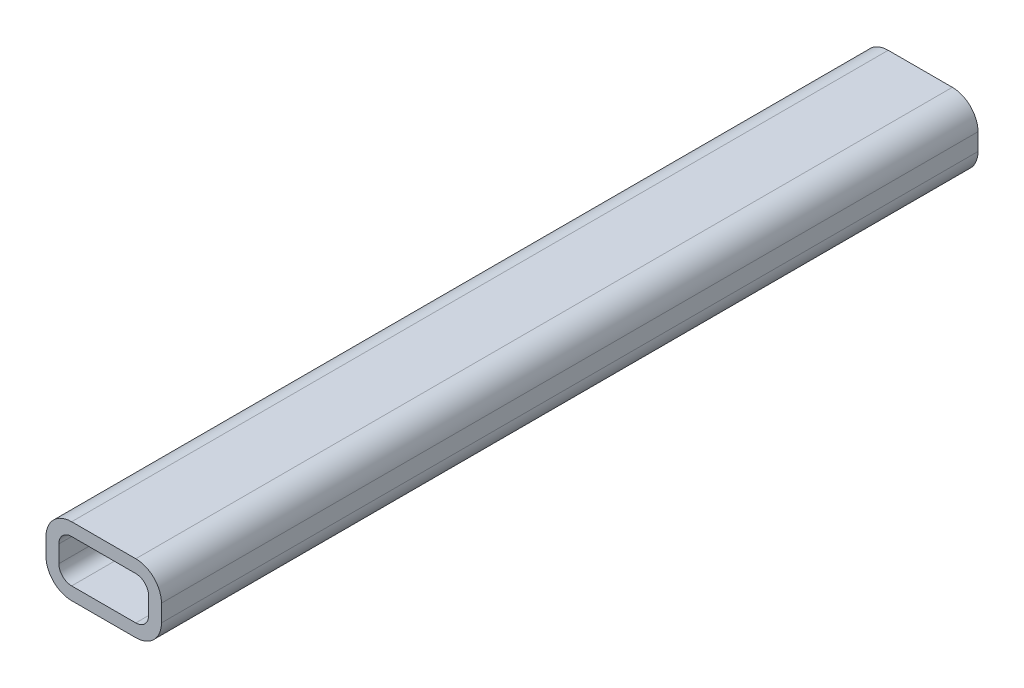
ISO-10303-21;
HEADER;
FILE_DESCRIPTION(('STEP AP214'),'2;1');
FILE_NAME('part.step','',(''),(''),'','','');
FILE_SCHEMA(('AUTOMOTIVE_DESIGN { 1 0 10303 214 1 1 1 1 }'));
ENDSEC;
DATA;
#1=APPLICATION_CONTEXT('core data for automotive mechanical design processes');
#2=APPLICATION_PROTOCOL_DEFINITION('international standard','automotive_design',2000,#1);
#3=PRODUCT_CONTEXT('',#1,'mechanical');
#4=PRODUCT('Part','Part','',(#3));
#5=PRODUCT_RELATED_PRODUCT_CATEGORY('part','',(#4));
#6=PRODUCT_DEFINITION_FORMATION('','',#4);
#7=PRODUCT_DEFINITION_CONTEXT('part definition',#1,'design');
#8=PRODUCT_DEFINITION('design','',#6,#7);
#9=PRODUCT_DEFINITION_SHAPE('','',#8);
#10=(LENGTH_UNIT() NAMED_UNIT(*) SI_UNIT(.MILLI.,.METRE.));
#11=(NAMED_UNIT(*) PLANE_ANGLE_UNIT() SI_UNIT($,.RADIAN.));
#12=(NAMED_UNIT(*) SI_UNIT($,.STERADIAN.) SOLID_ANGLE_UNIT());
#13=UNCERTAINTY_MEASURE_WITH_UNIT(LENGTH_MEASURE(1.E-05),#10,'distance_accuracy_value','');
#14=(GEOMETRIC_REPRESENTATION_CONTEXT(3) GLOBAL_UNCERTAINTY_ASSIGNED_CONTEXT((#13)) GLOBAL_UNIT_ASSIGNED_CONTEXT((#10,
#11,#12)) REPRESENTATION_CONTEXT('',''));
#15=CARTESIAN_POINT('',(0.,0.,0.));
#16=DIRECTION('',(0.,0.,1.));
#17=DIRECTION('',(1.,0.,0.));
#18=AXIS2_PLACEMENT_3D('',#15,#16,#17);
#19=CARTESIAN_POINT('',(0.,-3.,191.));
#20=DIRECTION('',(0.,0.,-1.));
#21=DIRECTION('',(-1.,0.,0.));
#22=AXIS2_PLACEMENT_3D('',#19,#20,#21);
#23=PLANE('',#22);
#24=CARTESIAN_POINT('',(0.,-3.,191.));
#25=DIRECTION('',(0.,0.,1.));
#26=DIRECTION('',(-1.,0.,0.));
#27=AXIS2_PLACEMENT_3D('',#24,#25,#26);
#28=CIRCLE('',#27,6.);
#29=CARTESIAN_POINT('',(6.,-3.,191.));
#30=VERTEX_POINT('',#29);
#31=CARTESIAN_POINT('',(0.,3.,191.));
#32=VERTEX_POINT('',#31);
#33=EDGE_CURVE('E216',#30,#32,#28,.T.);
#34=ORIENTED_EDGE('',*,*,#33,.T.);
#35=DIRECTION('',(-1.,0.,0.));
#36=VECTOR('',#35,1.);
#37=CARTESIAN_POINT('',(0.,3.,191.));
#38=LINE('',#37,#36);
#39=CARTESIAN_POINT('',(-15.,3.,191.));
#40=VERTEX_POINT('',#39);
#41=EDGE_CURVE('E219',#32,#40,#38,.T.);
#42=ORIENTED_EDGE('',*,*,#41,.T.);
#43=CARTESIAN_POINT('',(-15.,-3.,191.));
#44=DIRECTION('',(0.,0.,1.));
#45=DIRECTION('',(1.,0.,0.));
#46=AXIS2_PLACEMENT_3D('',#43,#44,#45);
#47=CIRCLE('',#46,6.);
#48=CARTESIAN_POINT('',(-21.,-3.,191.));
#49=VERTEX_POINT('',#48);
#50=EDGE_CURVE('E222',#40,#49,#47,.T.);
#51=ORIENTED_EDGE('',*,*,#50,.T.);
#52=DIRECTION('',(0.,-1.,0.));
#53=VECTOR('',#52,1.);
#54=CARTESIAN_POINT('',(-21.,-3.,191.));
#55=LINE('',#54,#53);
#56=CARTESIAN_POINT('',(-21.,-7.,191.));
#57=VERTEX_POINT('',#56);
#58=EDGE_CURVE('E224',#49,#57,#55,.T.);
#59=ORIENTED_EDGE('',*,*,#58,.T.);
#60=CARTESIAN_POINT('',(-15.,-7.,191.));
#61=DIRECTION('',(0.,0.,1.));
#62=DIRECTION('',(-1.,0.,0.));
#63=AXIS2_PLACEMENT_3D('',#60,#61,#62);
#64=CIRCLE('',#63,6.);
#65=CARTESIAN_POINT('',(-15.,-13.,191.));
#66=VERTEX_POINT('',#65);
#67=EDGE_CURVE('E226',#57,#66,#64,.T.);
#68=ORIENTED_EDGE('',*,*,#67,.T.);
#69=DIRECTION('',(1.,0.,0.));
#70=VECTOR('',#69,1.);
#71=CARTESIAN_POINT('',(0.,-13.,191.));
#72=LINE('',#71,#70);
#73=CARTESIAN_POINT('',(0.,-13.,191.));
#74=VERTEX_POINT('',#73);
#75=EDGE_CURVE('E228',#66,#74,#72,.T.);
#76=ORIENTED_EDGE('',*,*,#75,.T.);
#77=CARTESIAN_POINT('',(0.,-7.,191.));
#78=DIRECTION('',(0.,0.,1.));
#79=DIRECTION('',(-1.,0.,0.));
#80=AXIS2_PLACEMENT_3D('',#77,#78,#79);
#81=CIRCLE('',#80,6.);
#82=CARTESIAN_POINT('',(6.,-7.,191.));
#83=VERTEX_POINT('',#82);
#84=EDGE_CURVE('E230',#74,#83,#81,.T.);
#85=ORIENTED_EDGE('',*,*,#84,.T.);
#86=DIRECTION('',(0.,1.,0.));
#87=VECTOR('',#86,1.);
#88=CARTESIAN_POINT('',(6.,-3.,191.));
#89=LINE('',#88,#87);
#90=EDGE_CURVE('E232',#83,#30,#89,.T.);
#91=ORIENTED_EDGE('',*,*,#90,.T.);
#92=EDGE_LOOP('',(#34,#42,#51,#59,#68,#76,#85,#91));
#93=FACE_BOUND('',#92,.T.);
#94=CARTESIAN_POINT('',(-15.,-7.,191.));
#95=DIRECTION('',(0.,0.,1.));
#96=DIRECTION('',(-1.,0.,0.));
#97=AXIS2_PLACEMENT_3D('',#94,#95,#96);
#98=CIRCLE('',#97,3.);
#99=CARTESIAN_POINT('',(-18.,-7.,191.));
#100=VERTEX_POINT('',#99);
#101=CARTESIAN_POINT('',(-15.,-10.,191.));
#102=VERTEX_POINT('',#101);
#103=EDGE_CURVE('E151',#100,#102,#98,.T.);
#104=ORIENTED_EDGE('',*,*,#103,.F.);
#105=DIRECTION('',(0.,-1.,0.));
#106=VECTOR('',#105,1.);
#107=CARTESIAN_POINT('',(-18.,-3.,191.));
#108=LINE('',#107,#106);
#109=CARTESIAN_POINT('',(-18.,-3.,191.));
#110=VERTEX_POINT('',#109);
#111=EDGE_CURVE('E184',#110,#100,#108,.T.);
#112=ORIENTED_EDGE('',*,*,#111,.F.);
#113=CARTESIAN_POINT('',(-15.,-3.,191.));
#114=DIRECTION('',(0.,0.,1.));
#115=DIRECTION('',(1.,0.,0.));
#116=AXIS2_PLACEMENT_3D('',#113,#114,#115);
#117=CIRCLE('',#116,3.);
#118=CARTESIAN_POINT('',(-15.,0.,191.));
#119=VERTEX_POINT('',#118);
#120=EDGE_CURVE('E182',#119,#110,#117,.T.);
#121=ORIENTED_EDGE('',*,*,#120,.F.);
#122=DIRECTION('',(-1.,0.,0.));
#123=VECTOR('',#122,1.);
#124=CARTESIAN_POINT('',(0.,0.,191.));
#125=LINE('',#124,#123);
#126=CARTESIAN_POINT('',(0.,0.,191.));
#127=VERTEX_POINT('',#126);
#128=EDGE_CURVE('E180',#127,#119,#125,.T.);
#129=ORIENTED_EDGE('',*,*,#128,.F.);
#130=CARTESIAN_POINT('',(0.,-3.,191.));
#131=DIRECTION('',(0.,0.,1.));
#132=DIRECTION('',(-1.,0.,0.));
#133=AXIS2_PLACEMENT_3D('',#130,#131,#132);
#134=CIRCLE('',#133,3.);
#135=CARTESIAN_POINT('',(3.,-3.,191.));
#136=VERTEX_POINT('',#135);
#137=EDGE_CURVE('E178',#136,#127,#134,.T.);
#138=ORIENTED_EDGE('',*,*,#137,.F.);
#139=DIRECTION('',(0.,1.,0.));
#140=VECTOR('',#139,1.);
#141=CARTESIAN_POINT('',(3.,-3.,191.));
#142=LINE('',#141,#140);
#143=CARTESIAN_POINT('',(3.,-7.,191.));
#144=VERTEX_POINT('',#143);
#145=EDGE_CURVE('E174',#144,#136,#142,.T.);
#146=ORIENTED_EDGE('',*,*,#145,.F.);
#147=CARTESIAN_POINT('',(0.,-7.,191.));
#148=DIRECTION('',(0.,0.,1.));
#149=DIRECTION('',(-1.,0.,0.));
#150=AXIS2_PLACEMENT_3D('',#147,#148,#149);
#151=CIRCLE('',#150,3.);
#152=CARTESIAN_POINT('',(0.,-10.,191.));
#153=VERTEX_POINT('',#152);
#154=EDGE_CURVE('E172',#153,#144,#151,.T.);
#155=ORIENTED_EDGE('',*,*,#154,.F.);
#156=DIRECTION('',(1.,0.,0.));
#157=VECTOR('',#156,1.);
#158=CARTESIAN_POINT('',(0.,-10.,191.));
#159=LINE('',#158,#157);
#160=EDGE_CURVE('E159',#102,#153,#159,.T.);
#161=ORIENTED_EDGE('',*,*,#160,.F.);
#162=EDGE_LOOP('',(#104,#112,#121,#129,#138,#146,#155,#161));
#163=FACE_BOUND('',#162,.T.);
#164=ADVANCED_FACE('F38',(#93,#163),#23,.F.);
#165=CARTESIAN_POINT('',(0.,-3.,0.));
#166=DIRECTION('',(0.,0.,-1.));
#167=DIRECTION('',(-1.,0.,0.));
#168=AXIS2_PLACEMENT_3D('',#165,#166,#167);
#169=PLANE('',#168);
#170=CARTESIAN_POINT('',(0.,-3.,0.));
#171=DIRECTION('',(0.,0.,1.));
#172=DIRECTION('',(-1.,0.,0.));
#173=AXIS2_PLACEMENT_3D('',#170,#171,#172);
#174=CIRCLE('',#173,6.);
#175=CARTESIAN_POINT('',(6.,-3.,0.));
#176=VERTEX_POINT('',#175);
#177=CARTESIAN_POINT('',(0.,3.,0.));
#178=VERTEX_POINT('',#177);
#179=EDGE_CURVE('E167',#176,#178,#174,.T.);
#180=ORIENTED_EDGE('',*,*,#179,.F.);
#181=DIRECTION('',(0.,1.,0.));
#182=VECTOR('',#181,1.);
#183=CARTESIAN_POINT('',(6.,-3.,0.));
#184=LINE('',#183,#182);
#185=CARTESIAN_POINT('',(6.,-7.,0.));
#186=VERTEX_POINT('',#185);
#187=EDGE_CURVE('E220',#186,#176,#184,.T.);
#188=ORIENTED_EDGE('',*,*,#187,.F.);
#189=CARTESIAN_POINT('',(0.,-7.,0.));
#190=DIRECTION('',(0.,0.,1.));
#191=DIRECTION('',(-1.,0.,0.));
#192=AXIS2_PLACEMENT_3D('',#189,#190,#191);
#193=CIRCLE('',#192,6.);
#194=CARTESIAN_POINT('',(0.,-13.,0.));
#195=VERTEX_POINT('',#194);
#196=EDGE_CURVE('E247',#195,#186,#193,.T.);
#197=ORIENTED_EDGE('',*,*,#196,.F.);
#198=DIRECTION('',(1.,0.,0.));
#199=VECTOR('',#198,1.);
#200=CARTESIAN_POINT('',(0.,-13.,0.));
#201=LINE('',#200,#199);
#202=CARTESIAN_POINT('',(-15.,-13.,0.));
#203=VERTEX_POINT('',#202);
#204=EDGE_CURVE('E245',#203,#195,#201,.T.);
#205=ORIENTED_EDGE('',*,*,#204,.F.);
#206=CARTESIAN_POINT('',(-15.,-7.,0.));
#207=DIRECTION('',(0.,0.,1.));
#208=DIRECTION('',(-1.,0.,0.));
#209=AXIS2_PLACEMENT_3D('',#206,#207,#208);
#210=CIRCLE('',#209,6.);
#211=CARTESIAN_POINT('',(-21.,-7.,0.));
#212=VERTEX_POINT('',#211);
#213=EDGE_CURVE('E243',#212,#203,#210,.T.);
#214=ORIENTED_EDGE('',*,*,#213,.F.);
#215=DIRECTION('',(0.,-1.,0.));
#216=VECTOR('',#215,1.);
#217=CARTESIAN_POINT('',(-21.,-3.,0.));
#218=LINE('',#217,#216);
#219=CARTESIAN_POINT('',(-21.,-3.,0.));
#220=VERTEX_POINT('',#219);
#221=EDGE_CURVE('E241',#220,#212,#218,.T.);
#222=ORIENTED_EDGE('',*,*,#221,.F.);
#223=CARTESIAN_POINT('',(-15.,-3.,0.));
#224=DIRECTION('',(0.,0.,1.));
#225=DIRECTION('',(1.,0.,0.));
#226=AXIS2_PLACEMENT_3D('',#223,#224,#225);
#227=CIRCLE('',#226,6.);
#228=CARTESIAN_POINT('',(-15.,3.,0.));
#229=VERTEX_POINT('',#228);
#230=EDGE_CURVE('E239',#229,#220,#227,.T.);
#231=ORIENTED_EDGE('',*,*,#230,.F.);
#232=DIRECTION('',(-1.,0.,0.));
#233=VECTOR('',#232,1.);
#234=CARTESIAN_POINT('',(0.,3.,0.));
#235=LINE('',#234,#233);
#236=EDGE_CURVE('E237',#178,#229,#235,.T.);
#237=ORIENTED_EDGE('',*,*,#236,.F.);
#238=EDGE_LOOP('',(#180,#188,#197,#205,#214,#222,#231,#237));
#239=FACE_BOUND('',#238,.T.);
#240=DIRECTION('',(0.,-1.,0.));
#241=VECTOR('',#240,1.);
#242=CARTESIAN_POINT('',(-18.,-3.,0.));
#243=LINE('',#242,#241);
#244=CARTESIAN_POINT('',(-18.,-3.,0.));
#245=VERTEX_POINT('',#244);
#246=CARTESIAN_POINT('',(-18.,-7.,0.));
#247=VERTEX_POINT('',#246);
#248=EDGE_CURVE('E160',#245,#247,#243,.T.);
#249=ORIENTED_EDGE('',*,*,#248,.T.);
#250=CARTESIAN_POINT('',(-15.,-7.,0.));
#251=DIRECTION('',(0.,0.,1.));
#252=DIRECTION('',(-1.,0.,0.));
#253=AXIS2_PLACEMENT_3D('',#250,#251,#252);
#254=CIRCLE('',#253,3.);
#255=CARTESIAN_POINT('',(-15.,-10.,0.));
#256=VERTEX_POINT('',#255);
#257=EDGE_CURVE('E61',#247,#256,#254,.T.);
#258=ORIENTED_EDGE('',*,*,#257,.T.);
#259=DIRECTION('',(1.,0.,0.));
#260=VECTOR('',#259,1.);
#261=CARTESIAN_POINT('',(0.,-10.,0.));
#262=LINE('',#261,#260);
#263=CARTESIAN_POINT('',(0.,-10.,0.));
#264=VERTEX_POINT('',#263);
#265=EDGE_CURVE('E166',#256,#264,#262,.T.);
#266=ORIENTED_EDGE('',*,*,#265,.T.);
#267=CARTESIAN_POINT('',(0.,-7.,0.));
#268=DIRECTION('',(0.,0.,1.));
#269=DIRECTION('',(-1.,0.,0.));
#270=AXIS2_PLACEMENT_3D('',#267,#268,#269);
#271=CIRCLE('',#270,3.);
#272=CARTESIAN_POINT('',(3.,-7.,0.));
#273=VERTEX_POINT('',#272);
#274=EDGE_CURVE('E188',#264,#273,#271,.T.);
#275=ORIENTED_EDGE('',*,*,#274,.T.);
#276=DIRECTION('',(0.,1.,0.));
#277=VECTOR('',#276,1.);
#278=CARTESIAN_POINT('',(3.,-3.,0.));
#279=LINE('',#278,#277);
#280=CARTESIAN_POINT('',(3.,-3.,0.));
#281=VERTEX_POINT('',#280);
#282=EDGE_CURVE('E191',#273,#281,#279,.T.);
#283=ORIENTED_EDGE('',*,*,#282,.T.);
#284=CARTESIAN_POINT('',(0.,-3.,0.));
#285=DIRECTION('',(0.,0.,1.));
#286=DIRECTION('',(-1.,0.,0.));
#287=AXIS2_PLACEMENT_3D('',#284,#285,#286);
#288=CIRCLE('',#287,3.);
#289=CARTESIAN_POINT('',(0.,0.,0.));
#290=VERTEX_POINT('',#289);
#291=EDGE_CURVE('E194',#281,#290,#288,.T.);
#292=ORIENTED_EDGE('',*,*,#291,.T.);
#293=DIRECTION('',(-1.,0.,0.));
#294=VECTOR('',#293,1.);
#295=CARTESIAN_POINT('',(0.,0.,0.));
#296=LINE('',#295,#294);
#297=CARTESIAN_POINT('',(-15.,0.,0.));
#298=VERTEX_POINT('',#297);
#299=EDGE_CURVE('E197',#290,#298,#296,.T.);
#300=ORIENTED_EDGE('',*,*,#299,.T.);
#301=CARTESIAN_POINT('',(-15.,-3.,0.));
#302=DIRECTION('',(0.,0.,1.));
#303=DIRECTION('',(1.,0.,0.));
#304=AXIS2_PLACEMENT_3D('',#301,#302,#303);
#305=CIRCLE('',#304,3.);
#306=EDGE_CURVE('E200',#298,#245,#305,.T.);
#307=ORIENTED_EDGE('',*,*,#306,.T.);
#308=EDGE_LOOP('',(#249,#258,#266,#275,#283,#292,#300,#307));
#309=FACE_BOUND('',#308,.T.);
#310=ADVANCED_FACE('F277',(#239,#309),#169,.T.);
#311=CARTESIAN_POINT('',(0.,-3.,191.));
#312=DIRECTION('',(0.,0.,-1.));
#313=DIRECTION('',(-1.,0.,0.));
#314=AXIS2_PLACEMENT_3D('',#311,#312,#313);
#315=CYLINDRICAL_SURFACE('',#314,6.);
#316=ORIENTED_EDGE('',*,*,#179,.T.);
#317=DIRECTION('',(0.,0.,-1.));
#318=VECTOR('',#317,1.);
#319=CARTESIAN_POINT('',(0.,3.,191.));
#320=LINE('',#319,#318);
#321=EDGE_CURVE('E11',#32,#178,#320,.T.);
#322=ORIENTED_EDGE('',*,*,#321,.F.);
#323=ORIENTED_EDGE('',*,*,#33,.F.);
#324=DIRECTION('',(0.,0.,-1.));
#325=VECTOR('',#324,1.);
#326=CARTESIAN_POINT('',(6.,-3.,191.));
#327=LINE('',#326,#325);
#328=EDGE_CURVE('E234',#30,#176,#327,.T.);
#329=ORIENTED_EDGE('',*,*,#328,.T.);
#330=EDGE_LOOP('',(#316,#322,#323,#329));
#331=FACE_BOUND('',#330,.T.);
#332=ADVANCED_FACE('F40',(#331),#315,.T.);
#333=CARTESIAN_POINT('',(0.,3.,191.));
#334=DIRECTION('',(0.,-1.,0.));
#335=DIRECTION('',(1.,0.,0.));
#336=AXIS2_PLACEMENT_3D('',#333,#334,#335);
#337=PLANE('',#336);
#338=ORIENTED_EDGE('',*,*,#236,.T.);
#339=DIRECTION('',(0.,0.,-1.));
#340=VECTOR('',#339,1.);
#341=CARTESIAN_POINT('',(-15.,3.,191.));
#342=LINE('',#341,#340);
#343=EDGE_CURVE('E46',#40,#229,#342,.T.);
#344=ORIENTED_EDGE('',*,*,#343,.F.);
#345=ORIENTED_EDGE('',*,*,#41,.F.);
#346=ORIENTED_EDGE('',*,*,#321,.T.);
#347=EDGE_LOOP('',(#338,#344,#345,#346));
#348=FACE_BOUND('',#347,.T.);
#349=ADVANCED_FACE('F294',(#348),#337,.F.);
#350=CARTESIAN_POINT('',(-15.,-3.,191.));
#351=DIRECTION('',(0.,0.,-1.));
#352=DIRECTION('',(-1.,0.,0.));
#353=AXIS2_PLACEMENT_3D('',#350,#351,#352);
#354=CYLINDRICAL_SURFACE('',#353,6.);
#355=ORIENTED_EDGE('',*,*,#230,.T.);
#356=DIRECTION('',(0.,0.,-1.));
#357=VECTOR('',#356,1.);
#358=CARTESIAN_POINT('',(-21.,-3.,191.));
#359=LINE('',#358,#357);
#360=EDGE_CURVE('E264',#49,#220,#359,.T.);
#361=ORIENTED_EDGE('',*,*,#360,.F.);
#362=ORIENTED_EDGE('',*,*,#50,.F.);
#363=ORIENTED_EDGE('',*,*,#343,.T.);
#364=EDGE_LOOP('',(#355,#361,#362,#363));
#365=FACE_BOUND('',#364,.T.);
#366=ADVANCED_FACE('F271',(#365),#354,.T.);
#367=CARTESIAN_POINT('',(-21.,-3.,191.));
#368=DIRECTION('',(1.,0.,0.));
#369=DIRECTION('',(0.,0.,-1.));
#370=AXIS2_PLACEMENT_3D('',#367,#368,#369);
#371=PLANE('',#370);
#372=ORIENTED_EDGE('',*,*,#221,.T.);
#373=DIRECTION('',(0.,0.,-1.));
#374=VECTOR('',#373,1.);
#375=CARTESIAN_POINT('',(-21.,-7.,191.));
#376=LINE('',#375,#374);
#377=EDGE_CURVE('E261',#57,#212,#376,.T.);
#378=ORIENTED_EDGE('',*,*,#377,.F.);
#379=ORIENTED_EDGE('',*,*,#58,.F.);
#380=ORIENTED_EDGE('',*,*,#360,.T.);
#381=EDGE_LOOP('',(#372,#378,#379,#380));
#382=FACE_BOUND('',#381,.T.);
#383=ADVANCED_FACE('F283',(#382),#371,.F.);
#384=CARTESIAN_POINT('',(-15.,-7.,191.));
#385=DIRECTION('',(0.,0.,-1.));
#386=DIRECTION('',(-1.,0.,0.));
#387=AXIS2_PLACEMENT_3D('',#384,#385,#386);
#388=CYLINDRICAL_SURFACE('',#387,6.);
#389=ORIENTED_EDGE('',*,*,#213,.T.);
#390=DIRECTION('',(0.,0.,-1.));
#391=VECTOR('',#390,1.);
#392=CARTESIAN_POINT('',(-15.,-13.,191.));
#393=LINE('',#392,#391);
#394=EDGE_CURVE('E258',#66,#203,#393,.T.);
#395=ORIENTED_EDGE('',*,*,#394,.F.);
#396=ORIENTED_EDGE('',*,*,#67,.F.);
#397=ORIENTED_EDGE('',*,*,#377,.T.);
#398=EDGE_LOOP('',(#389,#395,#396,#397));
#399=FACE_BOUND('',#398,.T.);
#400=ADVANCED_FACE('F287',(#399),#388,.T.);
#401=CARTESIAN_POINT('',(0.,-13.,191.));
#402=DIRECTION('',(0.,1.,0.));
#403=DIRECTION('',(-1.,0.,0.));
#404=AXIS2_PLACEMENT_3D('',#401,#402,#403);
#405=PLANE('',#404);
#406=ORIENTED_EDGE('',*,*,#204,.T.);
#407=DIRECTION('',(0.,0.,-1.));
#408=VECTOR('',#407,1.);
#409=CARTESIAN_POINT('',(0.,-13.,191.));
#410=LINE('',#409,#408);
#411=EDGE_CURVE('E255',#74,#195,#410,.T.);
#412=ORIENTED_EDGE('',*,*,#411,.F.);
#413=ORIENTED_EDGE('',*,*,#75,.F.);
#414=ORIENTED_EDGE('',*,*,#394,.T.);
#415=EDGE_LOOP('',(#406,#412,#413,#414));
#416=FACE_BOUND('',#415,.T.);
#417=ADVANCED_FACE('F307',(#416),#405,.F.);
#418=CARTESIAN_POINT('',(0.,-7.,191.));
#419=DIRECTION('',(0.,0.,-1.));
#420=DIRECTION('',(-1.,0.,0.));
#421=AXIS2_PLACEMENT_3D('',#418,#419,#420);
#422=CYLINDRICAL_SURFACE('',#421,6.);
#423=ORIENTED_EDGE('',*,*,#196,.T.);
#424=DIRECTION('',(0.,0.,-1.));
#425=VECTOR('',#424,1.);
#426=CARTESIAN_POINT('',(6.,-7.,191.));
#427=LINE('',#426,#425);
#428=EDGE_CURVE('E252',#83,#186,#427,.T.);
#429=ORIENTED_EDGE('',*,*,#428,.F.);
#430=ORIENTED_EDGE('',*,*,#84,.F.);
#431=ORIENTED_EDGE('',*,*,#411,.T.);
#432=EDGE_LOOP('',(#423,#429,#430,#431));
#433=FACE_BOUND('',#432,.T.);
#434=ADVANCED_FACE('F305',(#433),#422,.T.);
#435=CARTESIAN_POINT('',(6.,-3.,191.));
#436=DIRECTION('',(-1.,0.,0.));
#437=DIRECTION('',(0.,-1.,0.));
#438=AXIS2_PLACEMENT_3D('',#435,#436,#437);
#439=PLANE('',#438);
#440=ORIENTED_EDGE('',*,*,#187,.T.);
#441=ORIENTED_EDGE('',*,*,#328,.F.);
#442=ORIENTED_EDGE('',*,*,#90,.F.);
#443=ORIENTED_EDGE('',*,*,#428,.T.);
#444=EDGE_LOOP('',(#440,#441,#442,#443));
#445=FACE_BOUND('',#444,.T.);
#446=ADVANCED_FACE('F300',(#445),#439,.F.);
#447=CARTESIAN_POINT('',(-15.,-7.,191.));
#448=DIRECTION('',(0.,0.,-1.));
#449=DIRECTION('',(-1.,0.,0.));
#450=AXIS2_PLACEMENT_3D('',#447,#448,#449);
#451=CYLINDRICAL_SURFACE('',#450,3.);
#452=ORIENTED_EDGE('',*,*,#257,.F.);
#453=DIRECTION('',(0.,0.,-1.));
#454=VECTOR('',#453,1.);
#455=CARTESIAN_POINT('',(-18.,-7.,191.));
#456=LINE('',#455,#454);
#457=EDGE_CURVE('E155',#100,#247,#456,.T.);
#458=ORIENTED_EDGE('',*,*,#457,.F.);
#459=ORIENTED_EDGE('',*,*,#103,.T.);
#460=DIRECTION('',(0.,0.,-1.));
#461=VECTOR('',#460,1.);
#462=CARTESIAN_POINT('',(-15.,-10.,191.));
#463=LINE('',#462,#461);
#464=EDGE_CURVE('E154',#102,#256,#463,.T.);
#465=ORIENTED_EDGE('',*,*,#464,.T.);
#466=EDGE_LOOP('',(#452,#458,#459,#465));
#467=FACE_BOUND('',#466,.T.);
#468=ADVANCED_FACE('F153',(#467),#451,.F.);
#469=CARTESIAN_POINT('',(0.,-10.,191.));
#470=DIRECTION('',(0.,1.,0.));
#471=DIRECTION('',(-1.,0.,0.));
#472=AXIS2_PLACEMENT_3D('',#469,#470,#471);
#473=PLANE('',#472);
#474=ORIENTED_EDGE('',*,*,#265,.F.);
#475=ORIENTED_EDGE('',*,*,#464,.F.);
#476=ORIENTED_EDGE('',*,*,#160,.T.);
#477=DIRECTION('',(0.,0.,-1.));
#478=VECTOR('',#477,1.);
#479=CARTESIAN_POINT('',(0.,-10.,191.));
#480=LINE('',#479,#478);
#481=EDGE_CURVE('E168',#153,#264,#480,.T.);
#482=ORIENTED_EDGE('',*,*,#481,.T.);
#483=EDGE_LOOP('',(#474,#475,#476,#482));
#484=FACE_BOUND('',#483,.T.);
#485=ADVANCED_FACE('F163',(#484),#473,.T.);
#486=CARTESIAN_POINT('',(0.,-7.,191.));
#487=DIRECTION('',(0.,0.,-1.));
#488=DIRECTION('',(-1.,0.,0.));
#489=AXIS2_PLACEMENT_3D('',#486,#487,#488);
#490=CYLINDRICAL_SURFACE('',#489,3.);
#491=ORIENTED_EDGE('',*,*,#274,.F.);
#492=ORIENTED_EDGE('',*,*,#481,.F.);
#493=ORIENTED_EDGE('',*,*,#154,.T.);
#494=DIRECTION('',(0.,0.,-1.));
#495=VECTOR('',#494,1.);
#496=CARTESIAN_POINT('',(3.,-7.,191.));
#497=LINE('',#496,#495);
#498=EDGE_CURVE('E213',#144,#273,#497,.T.);
#499=ORIENTED_EDGE('',*,*,#498,.T.);
#500=EDGE_LOOP('',(#491,#492,#493,#499));
#501=FACE_BOUND('',#500,.T.);
#502=ADVANCED_FACE('F332',(#501),#490,.F.);
#503=CARTESIAN_POINT('',(3.,-3.,191.));
#504=DIRECTION('',(-1.,0.,0.));
#505=DIRECTION('',(0.,-1.,0.));
#506=AXIS2_PLACEMENT_3D('',#503,#504,#505);
#507=PLANE('',#506);
#508=ORIENTED_EDGE('',*,*,#282,.F.);
#509=ORIENTED_EDGE('',*,*,#498,.F.);
#510=ORIENTED_EDGE('',*,*,#145,.T.);
#511=DIRECTION('',(0.,0.,-1.));
#512=VECTOR('',#511,1.);
#513=CARTESIAN_POINT('',(3.,-3.,191.));
#514=LINE('',#513,#512);
#515=EDGE_CURVE('E211',#136,#281,#514,.T.);
#516=ORIENTED_EDGE('',*,*,#515,.T.);
#517=EDGE_LOOP('',(#508,#509,#510,#516));
#518=FACE_BOUND('',#517,.T.);
#519=ADVANCED_FACE('F336',(#518),#507,.T.);
#520=CARTESIAN_POINT('',(0.,-3.,191.));
#521=DIRECTION('',(0.,0.,-1.));
#522=DIRECTION('',(-1.,0.,0.));
#523=AXIS2_PLACEMENT_3D('',#520,#521,#522);
#524=CYLINDRICAL_SURFACE('',#523,3.);
#525=ORIENTED_EDGE('',*,*,#291,.F.);
#526=ORIENTED_EDGE('',*,*,#515,.F.);
#527=ORIENTED_EDGE('',*,*,#137,.T.);
#528=DIRECTION('',(0.,0.,-1.));
#529=VECTOR('',#528,1.);
#530=CARTESIAN_POINT('',(0.,0.,191.));
#531=LINE('',#530,#529);
#532=EDGE_CURVE('E209',#127,#290,#531,.T.);
#533=ORIENTED_EDGE('',*,*,#532,.T.);
#534=EDGE_LOOP('',(#525,#526,#527,#533));
#535=FACE_BOUND('',#534,.T.);
#536=ADVANCED_FACE('F342',(#535),#524,.F.);
#537=CARTESIAN_POINT('',(0.,0.,191.));
#538=DIRECTION('',(0.,-1.,0.));
#539=DIRECTION('',(1.,0.,0.));
#540=AXIS2_PLACEMENT_3D('',#537,#538,#539);
#541=PLANE('',#540);
#542=ORIENTED_EDGE('',*,*,#299,.F.);
#543=ORIENTED_EDGE('',*,*,#532,.F.);
#544=ORIENTED_EDGE('',*,*,#128,.T.);
#545=DIRECTION('',(0.,0.,-1.));
#546=VECTOR('',#545,1.);
#547=CARTESIAN_POINT('',(-15.,0.,191.));
#548=LINE('',#547,#546);
#549=EDGE_CURVE('E207',#119,#298,#548,.T.);
#550=ORIENTED_EDGE('',*,*,#549,.T.);
#551=EDGE_LOOP('',(#542,#543,#544,#550));
#552=FACE_BOUND('',#551,.T.);
#553=ADVANCED_FACE('F346',(#552),#541,.T.);
#554=CARTESIAN_POINT('',(-15.,-3.,191.));
#555=DIRECTION('',(0.,0.,-1.));
#556=DIRECTION('',(-1.,0.,0.));
#557=AXIS2_PLACEMENT_3D('',#554,#555,#556);
#558=CYLINDRICAL_SURFACE('',#557,3.);
#559=ORIENTED_EDGE('',*,*,#306,.F.);
#560=ORIENTED_EDGE('',*,*,#549,.F.);
#561=ORIENTED_EDGE('',*,*,#120,.T.);
#562=DIRECTION('',(0.,0.,-1.));
#563=VECTOR('',#562,1.);
#564=CARTESIAN_POINT('',(-18.,-3.,191.));
#565=LINE('',#564,#563);
#566=EDGE_CURVE('E53',#110,#245,#565,.T.);
#567=ORIENTED_EDGE('',*,*,#566,.T.);
#568=EDGE_LOOP('',(#559,#560,#561,#567));
#569=FACE_BOUND('',#568,.T.);
#570=ADVANCED_FACE('F350',(#569),#558,.F.);
#571=CARTESIAN_POINT('',(-18.,-3.,191.));
#572=DIRECTION('',(1.,0.,0.));
#573=DIRECTION('',(0.,1.,0.));
#574=AXIS2_PLACEMENT_3D('',#571,#572,#573);
#575=PLANE('',#574);
#576=ORIENTED_EDGE('',*,*,#248,.F.);
#577=ORIENTED_EDGE('',*,*,#566,.F.);
#578=ORIENTED_EDGE('',*,*,#111,.T.);
#579=ORIENTED_EDGE('',*,*,#457,.T.);
#580=EDGE_LOOP('',(#576,#577,#578,#579));
#581=FACE_BOUND('',#580,.T.);
#582=ADVANCED_FACE('F354',(#581),#575,.T.);
#583=CLOSED_SHELL('',(#164,#310,#332,#349,#366,#383,#400,#417,#434,#446,#468,#485,#502,#519,
#536,#553,#570,#582));
#584=MANIFOLD_SOLID_BREP('B2',#583);
#585=ADVANCED_BREP_SHAPE_REPRESENTATION('',(#18,#584),#14);
#586=SHAPE_DEFINITION_REPRESENTATION(#9,#585);
ENDSEC;
END-ISO-10303-21;
